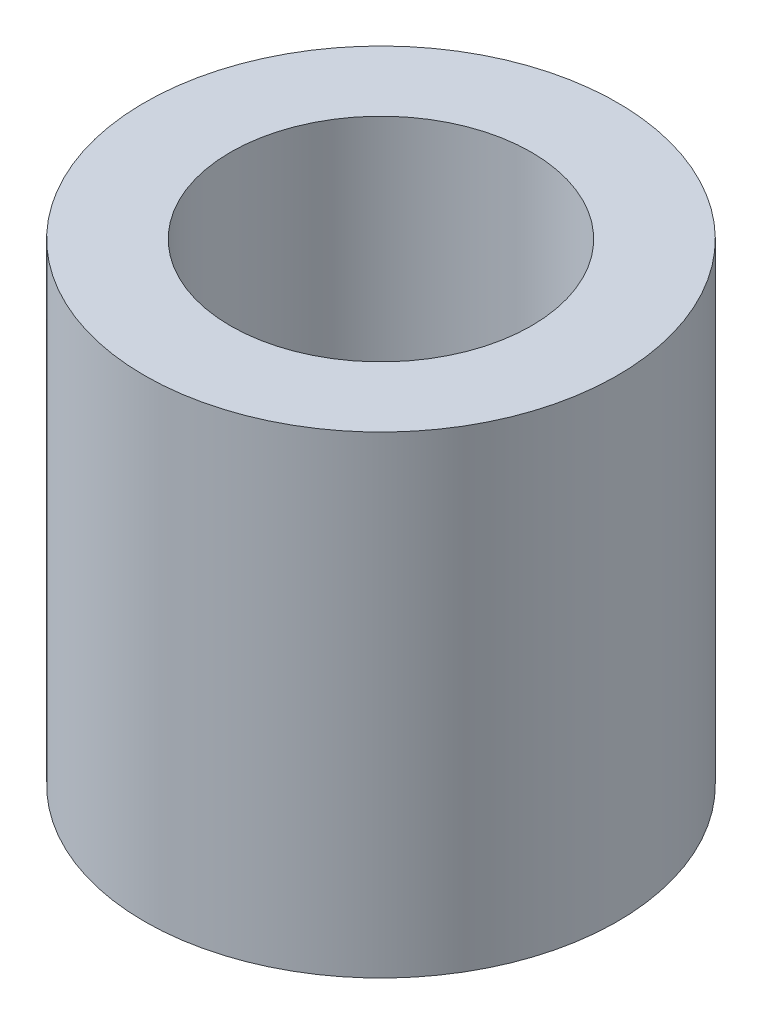
ISO-10303-21;
HEADER;
FILE_DESCRIPTION(('STEP AP214'),'2;1');
FILE_NAME('part.step','',(''),(''),'','','');
FILE_SCHEMA(('AUTOMOTIVE_DESIGN { 1 0 10303 214 1 1 1 1 }'));
ENDSEC;
DATA;
#1=APPLICATION_CONTEXT('core data for automotive mechanical design processes');
#2=APPLICATION_PROTOCOL_DEFINITION('international standard','automotive_design',2000,#1);
#3=PRODUCT_CONTEXT('',#1,'mechanical');
#4=PRODUCT('Part','Part','',(#3));
#5=PRODUCT_RELATED_PRODUCT_CATEGORY('part','',(#4));
#6=PRODUCT_DEFINITION_FORMATION('','',#4);
#7=PRODUCT_DEFINITION_CONTEXT('part definition',#1,'design');
#8=PRODUCT_DEFINITION('design','',#6,#7);
#9=PRODUCT_DEFINITION_SHAPE('','',#8);
#10=(LENGTH_UNIT() NAMED_UNIT(*) SI_UNIT(.MILLI.,.METRE.));
#11=(NAMED_UNIT(*) PLANE_ANGLE_UNIT() SI_UNIT($,.RADIAN.));
#12=(NAMED_UNIT(*) SI_UNIT($,.STERADIAN.) SOLID_ANGLE_UNIT());
#13=UNCERTAINTY_MEASURE_WITH_UNIT(LENGTH_MEASURE(1.E-05),#10,'distance_accuracy_value','');
#14=(GEOMETRIC_REPRESENTATION_CONTEXT(3) GLOBAL_UNCERTAINTY_ASSIGNED_CONTEXT((#13)) GLOBAL_UNIT_ASSIGNED_CONTEXT((#10,
#11,#12)) REPRESENTATION_CONTEXT('',''));
#15=CARTESIAN_POINT('',(0.,0.,0.));
#16=DIRECTION('',(0.,0.,1.));
#17=DIRECTION('',(1.,0.,0.));
#18=AXIS2_PLACEMENT_3D('',#15,#16,#17);
#19=CARTESIAN_POINT('',(0.,5.5,0.));
#20=DIRECTION('',(0.,-1.,0.));
#21=DIRECTION('',(0.,0.,-1.));
#22=AXIS2_PLACEMENT_3D('',#19,#20,#21);
#23=CYLINDRICAL_SURFACE('',#22,2.75);
#24=CARTESIAN_POINT('',(0.,5.5,0.));
#25=DIRECTION('',(0.,1.,0.));
#26=DIRECTION('',(0.,0.,1.));
#27=AXIS2_PLACEMENT_3D('',#24,#25,#26);
#28=CIRCLE('',#27,2.75);
#29=CARTESIAN_POINT('',(0.,5.5,2.75));
#30=VERTEX_POINT('',#29);
#31=EDGE_CURVE('E10',#30,#30,#28,.T.);
#32=ORIENTED_EDGE('',*,*,#31,.F.);
#33=EDGE_LOOP('',(#32));
#34=FACE_BOUND('',#33,.T.);
#35=CARTESIAN_POINT('',(0.,0.,0.));
#36=DIRECTION('',(0.,1.,0.));
#37=DIRECTION('',(0.,0.,1.));
#38=AXIS2_PLACEMENT_3D('',#35,#36,#37);
#39=CIRCLE('',#38,2.75);
#40=CARTESIAN_POINT('',(0.,0.,2.75));
#41=VERTEX_POINT('',#40);
#42=EDGE_CURVE('E40',#41,#41,#39,.T.);
#43=ORIENTED_EDGE('',*,*,#42,.T.);
#44=EDGE_LOOP('',(#43));
#45=FACE_BOUND('',#44,.T.);
#46=ADVANCED_FACE('F37',(#34,#45),#23,.T.);
#47=CARTESIAN_POINT('',(0.,5.5,0.));
#48=DIRECTION('',(0.,1.,0.));
#49=DIRECTION('',(0.,0.,1.));
#50=AXIS2_PLACEMENT_3D('',#47,#48,#49);
#51=PLANE('',#50);
#52=CARTESIAN_POINT('',(0.,5.5,0.));
#53=DIRECTION('',(0.,1.,0.));
#54=DIRECTION('',(0.,0.,1.));
#55=AXIS2_PLACEMENT_3D('',#52,#53,#54);
#56=CIRCLE('',#55,1.75);
#57=CARTESIAN_POINT('',(0.,5.5,1.75));
#58=VERTEX_POINT('',#57);
#59=EDGE_CURVE('E54',#58,#58,#56,.T.);
#60=ORIENTED_EDGE('',*,*,#59,.F.);
#61=EDGE_LOOP('',(#60));
#62=FACE_BOUND('',#61,.T.);
#63=ORIENTED_EDGE('',*,*,#31,.T.);
#64=EDGE_LOOP('',(#63));
#65=FACE_BOUND('',#64,.T.);
#66=ADVANCED_FACE('F61',(#62,#65),#51,.T.);
#67=CARTESIAN_POINT('',(0.,0.,0.));
#68=DIRECTION('',(0.,1.,0.));
#69=DIRECTION('',(0.,0.,1.));
#70=AXIS2_PLACEMENT_3D('',#67,#68,#69);
#71=PLANE('',#70);
#72=CARTESIAN_POINT('',(0.,0.,0.));
#73=DIRECTION('',(0.,1.,0.));
#74=DIRECTION('',(0.,0.,1.));
#75=AXIS2_PLACEMENT_3D('',#72,#73,#74);
#76=CIRCLE('',#75,1.75);
#77=CARTESIAN_POINT('',(0.,0.,1.75));
#78=VERTEX_POINT('',#77);
#79=EDGE_CURVE('E49',#78,#78,#76,.T.);
#80=ORIENTED_EDGE('',*,*,#79,.T.);
#81=EDGE_LOOP('',(#80));
#82=FACE_BOUND('',#81,.T.);
#83=ORIENTED_EDGE('',*,*,#42,.F.);
#84=EDGE_LOOP('',(#83));
#85=FACE_BOUND('',#84,.T.);
#86=ADVANCED_FACE('F63',(#82,#85),#71,.F.);
#87=CARTESIAN_POINT('',(0.,5.5,0.));
#88=DIRECTION('',(0.,1.,0.));
#89=DIRECTION('',(0.,0.,1.));
#90=AXIS2_PLACEMENT_3D('',#87,#88,#89);
#91=CYLINDRICAL_SURFACE('',#90,1.75);
#92=ORIENTED_EDGE('',*,*,#79,.F.);
#93=EDGE_LOOP('',(#92));
#94=FACE_BOUND('',#93,.T.);
#95=ORIENTED_EDGE('',*,*,#59,.T.);
#96=EDGE_LOOP('',(#95));
#97=FACE_BOUND('',#96,.T.);
#98=ADVANCED_FACE('F59',(#94,#97),#91,.F.);
#99=CLOSED_SHELL('',(#46,#66,#86,#98));
#100=MANIFOLD_SOLID_BREP('B2',#99);
#101=ADVANCED_BREP_SHAPE_REPRESENTATION('',(#18,#100),#14);
#102=SHAPE_DEFINITION_REPRESENTATION(#9,#101);
ENDSEC;
END-ISO-10303-21;
